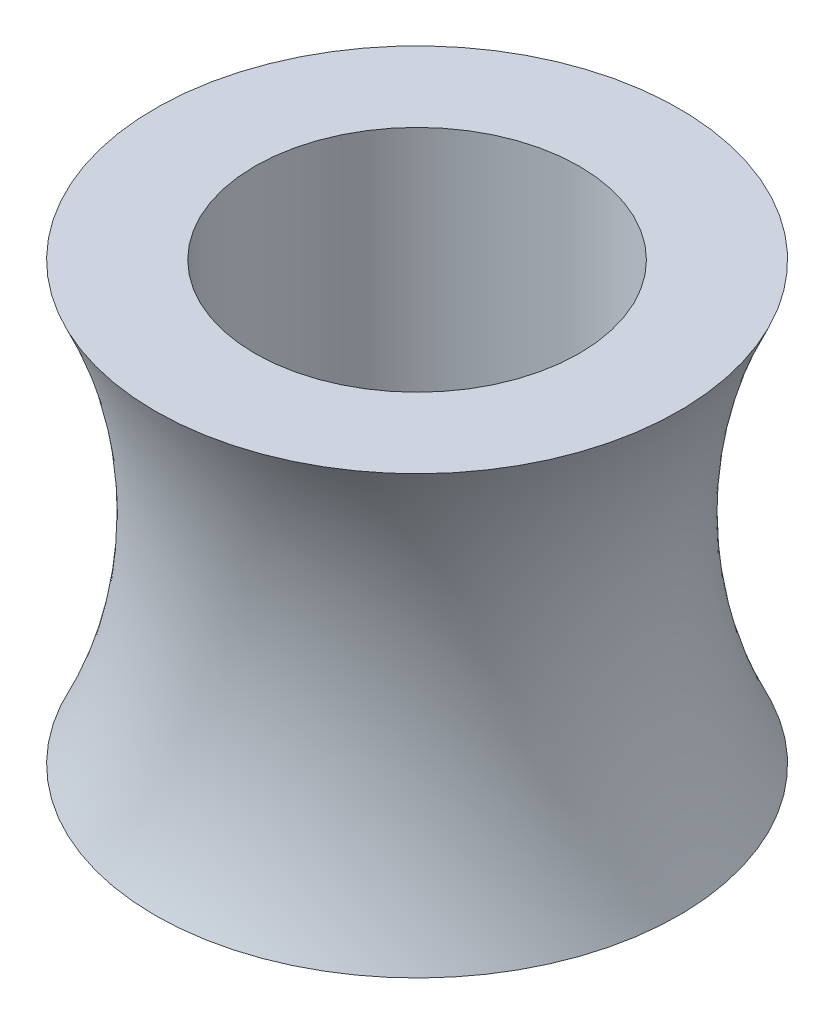
ISO-10303-21;
HEADER;
FILE_DESCRIPTION(('STEP AP214'),'2;1');
FILE_NAME('part.step','',(''),(''),'','','');
FILE_SCHEMA(('AUTOMOTIVE_DESIGN { 1 0 10303 214 1 1 1 1 }'));
ENDSEC;
DATA;
#1=APPLICATION_CONTEXT('core data for automotive mechanical design processes');
#2=APPLICATION_PROTOCOL_DEFINITION('international standard','automotive_design',2000,#1);
#3=PRODUCT_CONTEXT('',#1,'mechanical');
#4=PRODUCT('Part','Part','',(#3));
#5=PRODUCT_RELATED_PRODUCT_CATEGORY('part','',(#4));
#6=PRODUCT_DEFINITION_FORMATION('','',#4);
#7=PRODUCT_DEFINITION_CONTEXT('part definition',#1,'design');
#8=PRODUCT_DEFINITION('design','',#6,#7);
#9=PRODUCT_DEFINITION_SHAPE('','',#8);
#10=(LENGTH_UNIT() NAMED_UNIT(*) SI_UNIT(.MILLI.,.METRE.));
#11=(NAMED_UNIT(*) PLANE_ANGLE_UNIT() SI_UNIT($,.RADIAN.));
#12=(NAMED_UNIT(*) SI_UNIT($,.STERADIAN.) SOLID_ANGLE_UNIT());
#13=UNCERTAINTY_MEASURE_WITH_UNIT(LENGTH_MEASURE(1.E-05),#10,'distance_accuracy_value','');
#14=(GEOMETRIC_REPRESENTATION_CONTEXT(3) GLOBAL_UNCERTAINTY_ASSIGNED_CONTEXT((#13)) GLOBAL_UNIT_ASSIGNED_CONTEXT((#10,
#11,#12)) REPRESENTATION_CONTEXT('',''));
#15=CARTESIAN_POINT('',(0.,0.,0.));
#16=DIRECTION('',(0.,0.,1.));
#17=DIRECTION('',(1.,0.,0.));
#18=AXIS2_PLACEMENT_3D('',#15,#16,#17);
#19=CARTESIAN_POINT('',(0.,17.5,0.));
#20=DIRECTION('',(0.,1.,0.));
#21=DIRECTION('',(0.,0.,1.));
#22=AXIS2_PLACEMENT_3D('',#19,#20,#21);
#23=PLANE('',#22);
#24=CARTESIAN_POINT('',(0.,17.5,0.));
#25=DIRECTION('',(0.,1.,0.));
#26=DIRECTION('',(0.,0.,1.));
#27=AXIS2_PLACEMENT_3D('',#24,#25,#26);
#28=CIRCLE('',#27,6.5);
#29=CARTESIAN_POINT('',(0.,17.5,6.5));
#30=VERTEX_POINT('',#29);
#31=EDGE_CURVE('E10',#30,#30,#28,.T.);
#32=ORIENTED_EDGE('',*,*,#31,.F.);
#33=EDGE_LOOP('',(#32));
#34=FACE_BOUND('',#33,.T.);
#35=CARTESIAN_POINT('',(0.,17.5,0.));
#36=DIRECTION('',(0.,1.,0.));
#37=DIRECTION('',(0.,0.,1.));
#38=AXIS2_PLACEMENT_3D('',#35,#36,#37);
#39=CIRCLE('',#38,10.5);
#40=CARTESIAN_POINT('',(0.,17.5,10.5));
#41=VERTEX_POINT('',#40);
#42=EDGE_CURVE('E42',#41,#41,#39,.T.);
#43=ORIENTED_EDGE('',*,*,#42,.T.);
#44=EDGE_LOOP('',(#43));
#45=FACE_BOUND('',#44,.T.);
#46=ADVANCED_FACE('F31',(#34,#45),#23,.T.);
#47=CARTESIAN_POINT('',(0.,0.,0.));
#48=DIRECTION('',(0.,1.,0.));
#49=DIRECTION('',(0.,0.,1.));
#50=AXIS2_PLACEMENT_3D('',#47,#48,#49);
#51=PLANE('',#50);
#52=CARTESIAN_POINT('',(0.,0.,0.));
#53=DIRECTION('',(0.,1.,0.));
#54=DIRECTION('',(0.,0.,1.));
#55=AXIS2_PLACEMENT_3D('',#52,#53,#54);
#56=CIRCLE('',#55,6.5);
#57=CARTESIAN_POINT('',(0.,0.,6.5));
#58=VERTEX_POINT('',#57);
#59=EDGE_CURVE('E35',#58,#58,#56,.T.);
#60=ORIENTED_EDGE('',*,*,#59,.T.);
#61=EDGE_LOOP('',(#60));
#62=FACE_BOUND('',#61,.T.);
#63=CARTESIAN_POINT('',(0.,0.,0.));
#64=DIRECTION('',(0.,1.,0.));
#65=DIRECTION('',(0.,0.,1.));
#66=AXIS2_PLACEMENT_3D('',#63,#64,#65);
#67=CIRCLE('',#66,10.5);
#68=CARTESIAN_POINT('',(0.,0.,10.5));
#69=VERTEX_POINT('',#68);
#70=EDGE_CURVE('E46',#69,#69,#67,.T.);
#71=ORIENTED_EDGE('',*,*,#70,.F.);
#72=EDGE_LOOP('',(#71));
#73=FACE_BOUND('',#72,.T.);
#74=ADVANCED_FACE('F33',(#62,#73),#51,.F.);
#75=CARTESIAN_POINT('',(0.,17.5,0.));
#76=DIRECTION('',(0.,-1.,0.));
#77=DIRECTION('',(0.,0.,-1.));
#78=AXIS2_PLACEMENT_3D('',#75,#76,#77);
#79=CYLINDRICAL_SURFACE('',#78,6.5);
#80=ORIENTED_EDGE('',*,*,#31,.T.);
#81=EDGE_LOOP('',(#80));
#82=FACE_BOUND('',#81,.T.);
#83=ORIENTED_EDGE('',*,*,#59,.F.);
#84=EDGE_LOOP('',(#83));
#85=FACE_BOUND('',#84,.T.);
#86=ADVANCED_FACE('F53',(#82,#85),#79,.F.);
#87=CARTESIAN_POINT('',(0.,8.75,0.));
#88=DIRECTION('',(0.,1.,0.));
#89=DIRECTION('',(0.,0.,1.));
#90=AXIS2_PLACEMENT_3D('',#87,#88,#89);
#91=TOROIDAL_SURFACE('',#90,28.640625,20.140625);
#92=ORIENTED_EDGE('',*,*,#42,.F.);
#93=EDGE_LOOP('',(#92));
#94=FACE_BOUND('',#93,.T.);
#95=ORIENTED_EDGE('',*,*,#70,.T.);
#96=EDGE_LOOP('',(#95));
#97=FACE_BOUND('',#96,.T.);
#98=ADVANCED_FACE('F50',(#94,#97),#91,.F.);
#99=CLOSED_SHELL('',(#46,#74,#86,#98));
#100=MANIFOLD_SOLID_BREP('B2',#99);
#101=ADVANCED_BREP_SHAPE_REPRESENTATION('',(#18,#100),#14);
#102=SHAPE_DEFINITION_REPRESENTATION(#9,#101);
ENDSEC;
END-ISO-10303-21;
